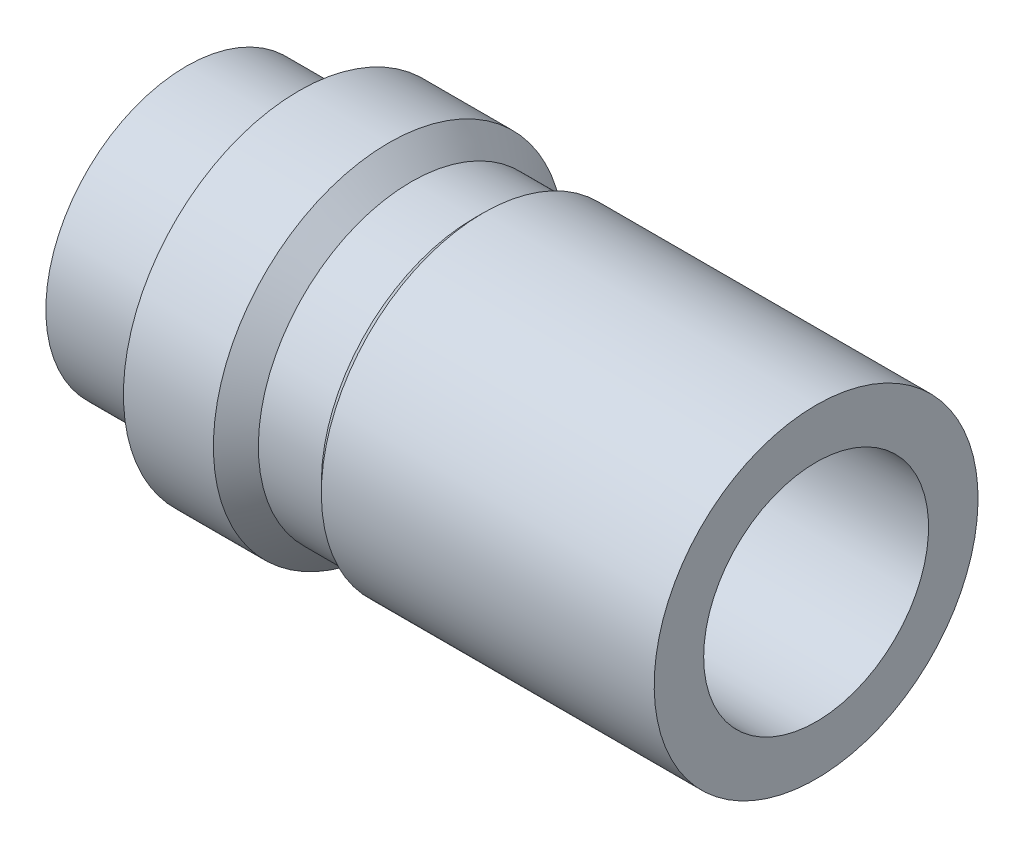
ISO-10303-21;
HEADER;
FILE_DESCRIPTION(('STEP AP214'),'2;1');
FILE_NAME('part.step','',(''),(''),'','','');
FILE_SCHEMA(('AUTOMOTIVE_DESIGN { 1 0 10303 214 1 1 1 1 }'));
ENDSEC;
DATA;
#1=APPLICATION_CONTEXT('core data for automotive mechanical design processes');
#2=APPLICATION_PROTOCOL_DEFINITION('international standard','automotive_design',2000,#1);
#3=PRODUCT_CONTEXT('',#1,'mechanical');
#4=PRODUCT('Part','Part','',(#3));
#5=PRODUCT_RELATED_PRODUCT_CATEGORY('part','',(#4));
#6=PRODUCT_DEFINITION_FORMATION('','',#4);
#7=PRODUCT_DEFINITION_CONTEXT('part definition',#1,'design');
#8=PRODUCT_DEFINITION('design','',#6,#7);
#9=PRODUCT_DEFINITION_SHAPE('','',#8);
#10=(LENGTH_UNIT() NAMED_UNIT(*) SI_UNIT(.MILLI.,.METRE.));
#11=(NAMED_UNIT(*) PLANE_ANGLE_UNIT() SI_UNIT($,.RADIAN.));
#12=(NAMED_UNIT(*) SI_UNIT($,.STERADIAN.) SOLID_ANGLE_UNIT());
#13=UNCERTAINTY_MEASURE_WITH_UNIT(LENGTH_MEASURE(1.E-05),#10,'distance_accuracy_value','');
#14=(GEOMETRIC_REPRESENTATION_CONTEXT(3) GLOBAL_UNCERTAINTY_ASSIGNED_CONTEXT((#13)) GLOBAL_UNIT_ASSIGNED_CONTEXT((#10,
#11,#12)) REPRESENTATION_CONTEXT('',''));
#15=CARTESIAN_POINT('',(0.,0.,0.));
#16=DIRECTION('',(0.,0.,1.));
#17=DIRECTION('',(1.,0.,0.));
#18=AXIS2_PLACEMENT_3D('',#15,#16,#17);
#19=CARTESIAN_POINT('',(35.56,0.,0.));
#20=DIRECTION('',(1.,0.,0.));
#21=DIRECTION('',(0.,1.,0.));
#22=AXIS2_PLACEMENT_3D('',#19,#20,#21);
#23=CYLINDRICAL_SURFACE('',#22,9.906);
#24=CARTESIAN_POINT('',(6.35,0.,0.));
#25=DIRECTION('',(1.,0.,0.));
#26=DIRECTION('',(0.,1.,0.));
#27=AXIS2_PLACEMENT_3D('',#24,#25,#26);
#28=CIRCLE('',#27,9.906);
#29=CARTESIAN_POINT('',(6.35,9.906,0.));
#30=VERTEX_POINT('',#29);
#31=EDGE_CURVE('E67',#30,#30,#28,.T.);
#32=ORIENTED_EDGE('',*,*,#31,.T.);
#33=EDGE_LOOP('',(#32));
#34=FACE_BOUND('',#33,.T.);
#35=CARTESIAN_POINT('',(11.43,0.,0.));
#36=DIRECTION('',(1.,0.,0.));
#37=DIRECTION('',(0.,1.,0.));
#38=AXIS2_PLACEMENT_3D('',#35,#36,#37);
#39=CIRCLE('',#38,9.906);
#40=CARTESIAN_POINT('',(11.43,9.906,0.));
#41=VERTEX_POINT('',#40);
#42=EDGE_CURVE('E43',#41,#41,#39,.T.);
#43=ORIENTED_EDGE('',*,*,#42,.F.);
#44=EDGE_LOOP('',(#43));
#45=FACE_BOUND('',#44,.T.);
#46=ADVANCED_FACE('F32',(#34,#45),#23,.T.);
#47=CARTESIAN_POINT('',(12.7,0.,0.));
#48=DIRECTION('',(-1.,0.,0.));
#49=DIRECTION('',(0.,-1.,0.));
#50=AXIS2_PLACEMENT_3D('',#47,#48,#49);
#51=CONICAL_SURFACE('',#50,8.636,0.78539816339745);
#52=ORIENTED_EDGE('',*,*,#42,.T.);
#53=EDGE_LOOP('',(#52));
#54=FACE_BOUND('',#53,.T.);
#55=CARTESIAN_POINT('',(12.7,0.,0.));
#56=DIRECTION('',(1.,0.,0.));
#57=DIRECTION('',(0.,1.,0.));
#58=AXIS2_PLACEMENT_3D('',#55,#56,#57);
#59=CIRCLE('',#58,8.63599999999999);
#60=CARTESIAN_POINT('',(12.7,8.63599999999999,0.));
#61=VERTEX_POINT('',#60);
#62=EDGE_CURVE('E47',#61,#61,#59,.T.);
#63=ORIENTED_EDGE('',*,*,#62,.F.);
#64=EDGE_LOOP('',(#63));
#65=FACE_BOUND('',#64,.T.);
#66=ADVANCED_FACE('F90',(#54,#65),#51,.T.);
#67=CARTESIAN_POINT('',(35.56,0.,0.));
#68=DIRECTION('',(1.,0.,0.));
#69=DIRECTION('',(0.,1.,0.));
#70=AXIS2_PLACEMENT_3D('',#67,#68,#69);
#71=CYLINDRICAL_SURFACE('',#70,8.63599999999999);
#72=ORIENTED_EDGE('',*,*,#62,.T.);
#73=EDGE_LOOP('',(#72));
#74=FACE_BOUND('',#73,.T.);
#75=CARTESIAN_POINT('',(16.256,0.,0.));
#76=DIRECTION('',(1.,0.,0.));
#77=DIRECTION('',(0.,1.,0.));
#78=AXIS2_PLACEMENT_3D('',#75,#76,#77);
#79=CIRCLE('',#78,8.63599999999999);
#80=CARTESIAN_POINT('',(16.256,8.63599999999999,0.));
#81=VERTEX_POINT('',#80);
#82=EDGE_CURVE('E52',#81,#81,#79,.T.);
#83=ORIENTED_EDGE('',*,*,#82,.F.);
#84=EDGE_LOOP('',(#83));
#85=FACE_BOUND('',#84,.T.);
#86=ADVANCED_FACE('F95',(#74,#85),#71,.T.);
#87=CARTESIAN_POINT('',(16.764,0.,0.));
#88=DIRECTION('',(1.,0.,0.));
#89=DIRECTION('',(0.,1.,0.));
#90=AXIS2_PLACEMENT_3D('',#87,#88,#89);
#91=CONICAL_SURFACE('',#90,9.144,0.785398163397448);
#92=ORIENTED_EDGE('',*,*,#82,.T.);
#93=EDGE_LOOP('',(#92));
#94=FACE_BOUND('',#93,.T.);
#95=CARTESIAN_POINT('',(16.764,0.,0.));
#96=DIRECTION('',(1.,0.,0.));
#97=DIRECTION('',(0.,1.,0.));
#98=AXIS2_PLACEMENT_3D('',#95,#96,#97);
#99=CIRCLE('',#98,9.144);
#100=CARTESIAN_POINT('',(16.764,9.144,0.));
#101=VERTEX_POINT('',#100);
#102=EDGE_CURVE('E55',#101,#101,#99,.T.);
#103=ORIENTED_EDGE('',*,*,#102,.F.);
#104=EDGE_LOOP('',(#103));
#105=FACE_BOUND('',#104,.T.);
#106=ADVANCED_FACE('F102',(#94,#105),#91,.T.);
#107=CARTESIAN_POINT('',(35.56,0.,0.));
#108=DIRECTION('',(1.,0.,0.));
#109=DIRECTION('',(0.,1.,0.));
#110=AXIS2_PLACEMENT_3D('',#107,#108,#109);
#111=CYLINDRICAL_SURFACE('',#110,9.144);
#112=ORIENTED_EDGE('',*,*,#102,.T.);
#113=EDGE_LOOP('',(#112));
#114=FACE_BOUND('',#113,.T.);
#115=CARTESIAN_POINT('',(35.56,0.,0.));
#116=DIRECTION('',(1.,0.,0.));
#117=DIRECTION('',(0.,1.,0.));
#118=AXIS2_PLACEMENT_3D('',#115,#116,#117);
#119=CIRCLE('',#118,9.144);
#120=CARTESIAN_POINT('',(35.56,9.144,0.));
#121=VERTEX_POINT('',#120);
#122=EDGE_CURVE('E58',#121,#121,#119,.T.);
#123=ORIENTED_EDGE('',*,*,#122,.F.);
#124=EDGE_LOOP('',(#123));
#125=FACE_BOUND('',#124,.T.);
#126=ADVANCED_FACE('F106',(#114,#125),#111,.T.);
#127=CARTESIAN_POINT('',(35.56,5.08,0.));
#128=DIRECTION('',(1.,0.,0.));
#129=DIRECTION('',(0.,1.,0.));
#130=AXIS2_PLACEMENT_3D('',#127,#128,#129);
#131=PLANE('',#130);
#132=CARTESIAN_POINT('',(35.56,0.,0.));
#133=DIRECTION('',(-1.,0.,0.));
#134=DIRECTION('',(0.,0.,1.));
#135=AXIS2_PLACEMENT_3D('',#132,#133,#134);
#136=CIRCLE('',#135,6.34999999999999);
#137=CARTESIAN_POINT('',(35.56,0.,6.34999999999999));
#138=VERTEX_POINT('',#137);
#139=EDGE_CURVE('E70',#138,#138,#136,.T.);
#140=ORIENTED_EDGE('',*,*,#139,.T.);
#141=EDGE_LOOP('',(#140));
#142=FACE_BOUND('',#141,.T.);
#143=ORIENTED_EDGE('',*,*,#122,.T.);
#144=EDGE_LOOP('',(#143));
#145=FACE_BOUND('',#144,.T.);
#146=ADVANCED_FACE('F74',(#142,#145),#131,.T.);
#147=CARTESIAN_POINT('',(0.,7.9375,0.));
#148=DIRECTION('',(-1.,0.,0.));
#149=DIRECTION('',(0.,-1.,0.));
#150=AXIS2_PLACEMENT_3D('',#147,#148,#149);
#151=PLANE('',#150);
#152=CARTESIAN_POINT('',(0.,0.,0.));
#153=DIRECTION('',(-1.,0.,0.));
#154=DIRECTION('',(0.,-1.,0.));
#155=AXIS2_PLACEMENT_3D('',#152,#153,#154);
#156=CIRCLE('',#155,7.11199999999998);
#157=CARTESIAN_POINT('',(0.,-7.11199999999998,0.));
#158=VERTEX_POINT('',#157);
#159=EDGE_CURVE('E10',#158,#158,#156,.F.);
#160=ORIENTED_EDGE('',*,*,#159,.T.);
#161=EDGE_LOOP('',(#160));
#162=FACE_BOUND('',#161,.T.);
#163=CARTESIAN_POINT('',(0.,0.,0.));
#164=DIRECTION('',(1.,0.,0.));
#165=DIRECTION('',(0.,1.,0.));
#166=AXIS2_PLACEMENT_3D('',#163,#164,#165);
#167=CIRCLE('',#166,7.9375);
#168=CARTESIAN_POINT('',(0.,7.9375,0.));
#169=VERTEX_POINT('',#168);
#170=EDGE_CURVE('E61',#169,#169,#167,.T.);
#171=ORIENTED_EDGE('',*,*,#170,.F.);
#172=EDGE_LOOP('',(#171));
#173=FACE_BOUND('',#172,.T.);
#174=ADVANCED_FACE('F113',(#162,#173),#151,.T.);
#175=CARTESIAN_POINT('',(35.56,0.,0.));
#176=DIRECTION('',(1.,0.,0.));
#177=DIRECTION('',(0.,1.,0.));
#178=AXIS2_PLACEMENT_3D('',#175,#176,#177);
#179=CYLINDRICAL_SURFACE('',#178,7.9375);
#180=ORIENTED_EDGE('',*,*,#170,.T.);
#181=EDGE_LOOP('',(#180));
#182=FACE_BOUND('',#181,.T.);
#183=CARTESIAN_POINT('',(6.35,0.,0.));
#184=DIRECTION('',(1.,0.,0.));
#185=DIRECTION('',(0.,1.,0.));
#186=AXIS2_PLACEMENT_3D('',#183,#184,#185);
#187=CIRCLE('',#186,7.9375);
#188=CARTESIAN_POINT('',(6.35,7.9375,0.));
#189=VERTEX_POINT('',#188);
#190=EDGE_CURVE('E64',#189,#189,#187,.T.);
#191=ORIENTED_EDGE('',*,*,#190,.F.);
#192=EDGE_LOOP('',(#191));
#193=FACE_BOUND('',#192,.T.);
#194=ADVANCED_FACE('F86',(#182,#193),#179,.T.);
#195=CARTESIAN_POINT('',(6.35,7.93750000000001,0.));
#196=DIRECTION('',(-1.,0.,0.));
#197=DIRECTION('',(0.,-1.,0.));
#198=AXIS2_PLACEMENT_3D('',#195,#196,#197);
#199=PLANE('',#198);
#200=ORIENTED_EDGE('',*,*,#190,.T.);
#201=EDGE_LOOP('',(#200));
#202=FACE_BOUND('',#201,.T.);
#203=ORIENTED_EDGE('',*,*,#31,.F.);
#204=EDGE_LOOP('',(#203));
#205=FACE_BOUND('',#204,.T.);
#206=ADVANCED_FACE('F79',(#202,#205),#199,.T.);
#207=CARTESIAN_POINT('',(0.,0.,0.));
#208=DIRECTION('',(-1.,0.,0.));
#209=DIRECTION('',(0.,0.,1.));
#210=AXIS2_PLACEMENT_3D('',#207,#208,#209);
#211=CYLINDRICAL_SURFACE('',#210,6.34999999999999);
#212=CARTESIAN_POINT('',(0.761999999999984,0.,0.));
#213=DIRECTION('',(-1.,0.,0.));
#214=DIRECTION('',(0.,0.,1.));
#215=AXIS2_PLACEMENT_3D('',#212,#213,#214);
#216=CIRCLE('',#215,6.34999999999999);
#217=CARTESIAN_POINT('',(0.761999999999984,0.,6.34999999999999));
#218=VERTEX_POINT('',#217);
#219=EDGE_CURVE('E39',#218,#218,#216,.T.);
#220=ORIENTED_EDGE('',*,*,#219,.T.);
#221=EDGE_LOOP('',(#220));
#222=FACE_BOUND('',#221,.T.);
#223=ORIENTED_EDGE('',*,*,#139,.F.);
#224=EDGE_LOOP('',(#223));
#225=FACE_BOUND('',#224,.T.);
#226=ADVANCED_FACE('F77',(#222,#225),#211,.F.);
#227=CARTESIAN_POINT('',(0.761999999999984,0.,0.));
#228=DIRECTION('',(-1.,0.,0.));
#229=DIRECTION('',(0.,0.,1.));
#230=AXIS2_PLACEMENT_3D('',#227,#228,#229);
#231=CONICAL_SURFACE('',#230,6.34999999999999,0.785398163397452);
#232=ORIENTED_EDGE('',*,*,#159,.F.);
#233=EDGE_LOOP('',(#232));
#234=FACE_BOUND('',#233,.T.);
#235=ORIENTED_EDGE('',*,*,#219,.F.);
#236=EDGE_LOOP('',(#235));
#237=FACE_BOUND('',#236,.T.);
#238=ADVANCED_FACE('F34',(#234,#237),#231,.F.);
#239=CLOSED_SHELL('',(#46,#66,#86,#106,#126,#146,#174,#194,#206,#226,#238));
#240=MANIFOLD_SOLID_BREP('B2',#239);
#241=ADVANCED_BREP_SHAPE_REPRESENTATION('',(#18,#240),#14);
#242=SHAPE_DEFINITION_REPRESENTATION(#9,#241);
ENDSEC;
END-ISO-10303-21;
